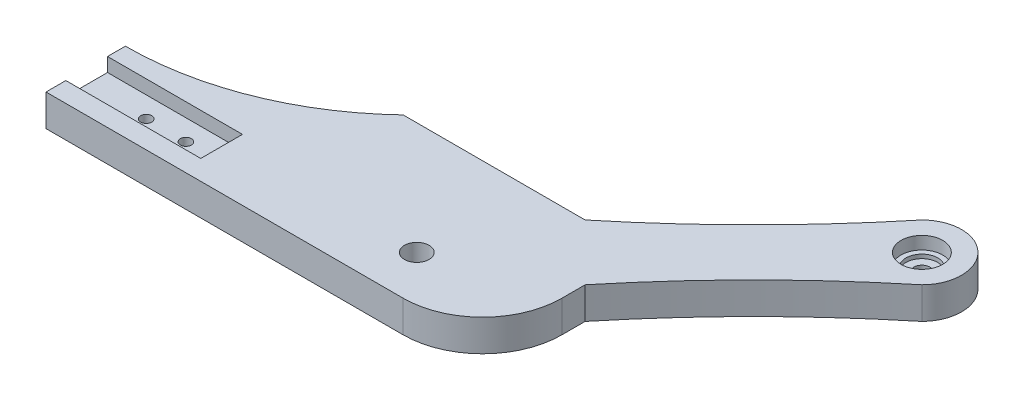
ISO-10303-21;
HEADER;
FILE_DESCRIPTION(('STEP AP214'),'2;1');
FILE_NAME('part.step','',(''),(''),'','','');
FILE_SCHEMA(('AUTOMOTIVE_DESIGN { 1 0 10303 214 1 1 1 1 }'));
ENDSEC;
DATA;
#1=APPLICATION_CONTEXT('core data for automotive mechanical design processes');
#2=APPLICATION_PROTOCOL_DEFINITION('international standard','automotive_design',2000,#1);
#3=PRODUCT_CONTEXT('',#1,'mechanical');
#4=PRODUCT('Part','Part','',(#3));
#5=PRODUCT_RELATED_PRODUCT_CATEGORY('part','',(#4));
#6=PRODUCT_DEFINITION_FORMATION('','',#4);
#7=PRODUCT_DEFINITION_CONTEXT('part definition',#1,'design');
#8=PRODUCT_DEFINITION('design','',#6,#7);
#9=PRODUCT_DEFINITION_SHAPE('','',#8);
#10=(LENGTH_UNIT() NAMED_UNIT(*) SI_UNIT(.MILLI.,.METRE.));
#11=(NAMED_UNIT(*) PLANE_ANGLE_UNIT() SI_UNIT($,.RADIAN.));
#12=(NAMED_UNIT(*) SI_UNIT($,.STERADIAN.) SOLID_ANGLE_UNIT());
#13=UNCERTAINTY_MEASURE_WITH_UNIT(LENGTH_MEASURE(1.E-05),#10,'distance_accuracy_value','');
#14=(GEOMETRIC_REPRESENTATION_CONTEXT(3) GLOBAL_UNCERTAINTY_ASSIGNED_CONTEXT((#13)) GLOBAL_UNIT_ASSIGNED_CONTEXT((#10,
#11,#12)) REPRESENTATION_CONTEXT('',''));
#15=CARTESIAN_POINT('',(0.,0.,0.));
#16=DIRECTION('',(0.,0.,1.));
#17=DIRECTION('',(1.,0.,0.));
#18=AXIS2_PLACEMENT_3D('',#15,#16,#17);
#19=CARTESIAN_POINT('',(26.7157287525382,0.,8.28427124746194));
#20=DIRECTION('',(0.,1.,0.));
#21=DIRECTION('',(0.,0.,1.));
#22=AXIS2_PLACEMENT_3D('',#19,#20,#21);
#23=CYLINDRICAL_SURFACE('',#22,3.09999999999999);
#24=CARTESIAN_POINT('',(26.7157287525382,0.,8.28427124746194));
#25=DIRECTION('',(0.,-1.,0.));
#26=DIRECTION('',(0.,0.,1.));
#27=AXIS2_PLACEMENT_3D('',#24,#25,#26);
#28=CIRCLE('',#27,3.09999999999999);
#29=CARTESIAN_POINT('',(26.7157287525382,0.,11.3842712474619));
#30=VERTEX_POINT('',#29);
#31=EDGE_CURVE('E274',#30,#30,#28,.T.);
#32=ORIENTED_EDGE('',*,*,#31,.T.);
#33=EDGE_LOOP('',(#32));
#34=FACE_BOUND('',#33,.T.);
#35=CARTESIAN_POINT('',(26.7157287525382,8.,8.28427124746194));
#36=DIRECTION('',(0.,1.,0.));
#37=DIRECTION('',(0.,0.,1.));
#38=AXIS2_PLACEMENT_3D('',#35,#36,#37);
#39=CIRCLE('',#38,3.09999999999999);
#40=CARTESIAN_POINT('',(26.7157287525382,8.,11.3842712474619));
#41=VERTEX_POINT('',#40);
#42=EDGE_CURVE('E278',#41,#41,#39,.F.);
#43=ORIENTED_EDGE('',*,*,#42,.F.);
#44=EDGE_LOOP('',(#43));
#45=FACE_BOUND('',#44,.T.);
#46=ADVANCED_FACE('F36',(#34,#45),#23,.F.);
#47=CARTESIAN_POINT('',(90.3553390593273,8.,-55.3553390593275));
#48=DIRECTION('',(0.,1.,0.));
#49=DIRECTION('',(0.,0.,1.));
#50=AXIS2_PLACEMENT_3D('',#47,#48,#49);
#51=PLANE('',#50);
#52=DIRECTION('',(1.,0.,0.));
#53=VECTOR('',#52,1.);
#54=CARTESIAN_POINT('',(-55.,8.,20.));
#55=LINE('',#54,#53);
#56=CARTESIAN_POINT('',(-55.,8.,20.));
#57=VERTEX_POINT('',#56);
#58=CARTESIAN_POINT('',(35.,8.,20.));
#59=VERTEX_POINT('',#58);
#60=EDGE_CURVE('E222',#57,#59,#55,.T.);
#61=ORIENTED_EDGE('',*,*,#60,.T.);
#62=CARTESIAN_POINT('',(35.,8.,0.));
#63=DIRECTION('',(0.,1.,0.));
#64=DIRECTION('',(0.,0.,1.));
#65=AXIS2_PLACEMENT_3D('',#62,#63,#64);
#66=CIRCLE('',#65,20.);
#67=CARTESIAN_POINT('',(55.,8.,0.));
#68=VERTEX_POINT('',#67);
#69=EDGE_CURVE('E11',#59,#68,#66,.T.);
#70=ORIENTED_EDGE('',*,*,#69,.T.);
#71=DIRECTION('',(0.,0.,-1.));
#72=VECTOR('',#71,1.);
#73=CARTESIAN_POINT('',(55.,8.,20.));
#74=LINE('',#73,#72);
#75=CARTESIAN_POINT('',(54.9999999999999,8.,-5.85786437626911));
#76=VERTEX_POINT('',#75);
#77=EDGE_CURVE('E225',#68,#76,#74,.T.);
#78=ORIENTED_EDGE('',*,*,#77,.T.);
#79=CARTESIAN_POINT('',(287.281912627651,8.,183.997641380188));
#80=DIRECTION('',(0.,-1.,0.));
#81=DIRECTION('',(1.,0.,0.));
#82=AXIS2_PLACEMENT_3D('',#79,#80,#81);
#83=CIRCLE('',#82,300.);
#84=CARTESIAN_POINT('',(97.4264068711927,8.,-48.2842712474621));
#85=VERTEX_POINT('',#84);
#86=EDGE_CURVE('E204',#76,#85,#83,.T.);
#87=ORIENTED_EDGE('',*,*,#86,.T.);
#88=CARTESIAN_POINT('',(90.3553390593273,8.,-55.3553390593275));
#89=DIRECTION('',(0.,1.,0.));
#90=DIRECTION('',(0.,0.,1.));
#91=AXIS2_PLACEMENT_3D('',#88,#89,#90);
#92=CIRCLE('',#91,10.);
#93=CARTESIAN_POINT('',(83.2842712474618,8.,-62.4264068711929));
#94=VERTEX_POINT('',#93);
#95=EDGE_CURVE('E228',#85,#94,#92,.T.);
#96=ORIENTED_EDGE('',*,*,#95,.T.);
#97=CARTESIAN_POINT('',(-148.997641380189,8.,-252.28191262765));
#98=DIRECTION('',(0.,1.,0.));
#99=DIRECTION('',(0.,0.,-1.));
#100=AXIS2_PLACEMENT_3D('',#97,#98,#99);
#101=CIRCLE('',#100,300.);
#102=CARTESIAN_POINT('',(40.857864376269,8.,-20.));
#103=VERTEX_POINT('',#102);
#104=EDGE_CURVE('E210',#103,#94,#101,.T.);
#105=ORIENTED_EDGE('',*,*,#104,.F.);
#106=DIRECTION('',(-1.,0.,0.));
#107=VECTOR('',#106,1.);
#108=CARTESIAN_POINT('',(-55.,8.,-20.));
#109=LINE('',#108,#107);
#110=CARTESIAN_POINT('',(-4.99999999999999,8.,-20.));
#111=VERTEX_POINT('',#110);
#112=EDGE_CURVE('E231',#103,#111,#109,.T.);
#113=ORIENTED_EDGE('',*,*,#112,.T.);
#114=CARTESIAN_POINT('',(-55.,8.,-72.5));
#115=DIRECTION('',(0.,1.,0.));
#116=DIRECTION('',(0.,0.,-1.));
#117=AXIS2_PLACEMENT_3D('',#114,#115,#116);
#118=CIRCLE('',#117,72.5);
#119=CARTESIAN_POINT('',(-55.,8.,0.));
#120=VERTEX_POINT('',#119);
#121=EDGE_CURVE('E171',#120,#111,#118,.T.);
#122=ORIENTED_EDGE('',*,*,#121,.F.);
#123=DIRECTION('',(0.,0.,1.));
#124=VECTOR('',#123,1.);
#125=CARTESIAN_POINT('',(-55.,8.,20.));
#126=LINE('',#125,#124);
#127=CARTESIAN_POINT('',(-55.,8.,4.5));
#128=VERTEX_POINT('',#127);
#129=EDGE_CURVE('E219',#120,#128,#126,.T.);
#130=ORIENTED_EDGE('',*,*,#129,.T.);
#131=DIRECTION('',(-1.,0.,0.));
#132=VECTOR('',#131,1.);
#133=CARTESIAN_POINT('',(-55.,8.,4.5));
#134=LINE('',#133,#132);
#135=CARTESIAN_POINT('',(-21.,8.,4.5));
#136=VERTEX_POINT('',#135);
#137=EDGE_CURVE('E154',#136,#128,#134,.T.);
#138=ORIENTED_EDGE('',*,*,#137,.F.);
#139=DIRECTION('',(0.,0.,-1.));
#140=VECTOR('',#139,1.);
#141=CARTESIAN_POINT('',(-21.,8.,15.));
#142=LINE('',#141,#140);
#143=CARTESIAN_POINT('',(-21.,8.,15.));
#144=VERTEX_POINT('',#143);
#145=EDGE_CURVE('E157',#144,#136,#142,.T.);
#146=ORIENTED_EDGE('',*,*,#145,.F.);
#147=DIRECTION('',(1.,0.,0.));
#148=VECTOR('',#147,1.);
#149=CARTESIAN_POINT('',(-55.,8.,15.));
#150=LINE('',#149,#148);
#151=CARTESIAN_POINT('',(-55.,8.,15.));
#152=VERTEX_POINT('',#151);
#153=EDGE_CURVE('E165',#152,#144,#150,.T.);
#154=ORIENTED_EDGE('',*,*,#153,.F.);
#155=EDGE_CURVE('E147',#152,#57,#126,.T.);
#156=ORIENTED_EDGE('',*,*,#155,.T.);
#157=EDGE_LOOP('',(#61,#70,#78,#87,#96,#105,#113,#122,#130,#138,#146,#154,#156));
#158=FACE_BOUND('',#157,.T.);
#159=CARTESIAN_POINT('',(90.3553390593273,8.,-55.3553390593275));
#160=DIRECTION('',(0.,1.,0.));
#161=DIRECTION('',(0.,0.,1.));
#162=AXIS2_PLACEMENT_3D('',#159,#160,#161);
#163=CIRCLE('',#162,5.24999999999999);
#164=CARTESIAN_POINT('',(90.3553390593273,8.,-50.1053390593275));
#165=VERTEX_POINT('',#164);
#166=EDGE_CURVE('E198',#165,#165,#163,.T.);
#167=ORIENTED_EDGE('',*,*,#166,.F.);
#168=EDGE_LOOP('',(#167));
#169=FACE_BOUND('',#168,.T.);
#170=ORIENTED_EDGE('',*,*,#42,.T.);
#171=EDGE_LOOP('',(#170));
#172=FACE_BOUND('',#171,.T.);
#173=ADVANCED_FACE('F282',(#158,#169,#172),#51,.T.);
#174=CARTESIAN_POINT('',(90.3553390593273,0.,-55.3553390593275));
#175=DIRECTION('',(0.,1.,0.));
#176=DIRECTION('',(0.,0.,1.));
#177=AXIS2_PLACEMENT_3D('',#174,#175,#176);
#178=PLANE('',#177);
#179=ORIENTED_EDGE('',*,*,#31,.F.);
#180=EDGE_LOOP('',(#179));
#181=FACE_BOUND('',#180,.T.);
#182=CARTESIAN_POINT('',(-40.,0.,9.75));
#183=DIRECTION('',(0.,1.,0.));
#184=DIRECTION('',(0.,0.,1.));
#185=AXIS2_PLACEMENT_3D('',#182,#183,#184);
#186=CIRCLE('',#185,1.4);
#187=CARTESIAN_POINT('',(-40.,0.,11.15));
#188=VERTEX_POINT('',#187);
#189=EDGE_CURVE('E266',#188,#188,#186,.T.);
#190=ORIENTED_EDGE('',*,*,#189,.T.);
#191=EDGE_LOOP('',(#190));
#192=FACE_BOUND('',#191,.T.);
#193=CARTESIAN_POINT('',(-30.,0.,9.75));
#194=DIRECTION('',(0.,1.,0.));
#195=DIRECTION('',(0.,0.,1.));
#196=AXIS2_PLACEMENT_3D('',#193,#194,#195);
#197=CIRCLE('',#196,1.4);
#198=CARTESIAN_POINT('',(-30.,0.,11.15));
#199=VERTEX_POINT('',#198);
#200=EDGE_CURVE('E160',#199,#199,#197,.T.);
#201=ORIENTED_EDGE('',*,*,#200,.T.);
#202=EDGE_LOOP('',(#201));
#203=FACE_BOUND('',#202,.T.);
#204=CARTESIAN_POINT('',(90.3553390593273,0.,-55.3553390593275));
#205=DIRECTION('',(0.,-1.,0.));
#206=DIRECTION('',(0.,0.,-1.));
#207=AXIS2_PLACEMENT_3D('',#204,#205,#206);
#208=CIRCLE('',#207,4.99999999999999);
#209=CARTESIAN_POINT('',(90.3553390593273,0.,-60.3553390593275));
#210=VERTEX_POINT('',#209);
#211=EDGE_CURVE('E188',#210,#210,#208,.T.);
#212=ORIENTED_EDGE('',*,*,#211,.F.);
#213=EDGE_LOOP('',(#212));
#214=FACE_BOUND('',#213,.T.);
#215=DIRECTION('',(0.,0.,-1.));
#216=VECTOR('',#215,1.);
#217=CARTESIAN_POINT('',(55.,0.,20.));
#218=LINE('',#217,#216);
#219=CARTESIAN_POINT('',(55.,0.,0.));
#220=VERTEX_POINT('',#219);
#221=CARTESIAN_POINT('',(55.,0.,-5.85786437626909));
#222=VERTEX_POINT('',#221);
#223=EDGE_CURVE('E239',#220,#222,#218,.T.);
#224=ORIENTED_EDGE('',*,*,#223,.F.);
#225=CARTESIAN_POINT('',(35.,0.,0.));
#226=DIRECTION('',(0.,1.,0.));
#227=DIRECTION('',(0.,0.,1.));
#228=AXIS2_PLACEMENT_3D('',#225,#226,#227);
#229=CIRCLE('',#228,20.);
#230=CARTESIAN_POINT('',(35.,0.,20.));
#231=VERTEX_POINT('',#230);
#232=EDGE_CURVE('E261',#220,#231,#229,.F.);
#233=ORIENTED_EDGE('',*,*,#232,.T.);
#234=DIRECTION('',(1.,0.,0.));
#235=VECTOR('',#234,1.);
#236=CARTESIAN_POINT('',(-55.,0.,20.));
#237=LINE('',#236,#235);
#238=CARTESIAN_POINT('',(-55.,0.,20.));
#239=VERTEX_POINT('',#238);
#240=EDGE_CURVE('E237',#239,#231,#237,.T.);
#241=ORIENTED_EDGE('',*,*,#240,.F.);
#242=DIRECTION('',(0.,0.,1.));
#243=VECTOR('',#242,1.);
#244=CARTESIAN_POINT('',(-55.,0.,20.));
#245=LINE('',#244,#243);
#246=CARTESIAN_POINT('',(-55.,0.,0.));
#247=VERTEX_POINT('',#246);
#248=EDGE_CURVE('E216',#247,#239,#245,.T.);
#249=ORIENTED_EDGE('',*,*,#248,.F.);
#250=CARTESIAN_POINT('',(-55.,0.,-72.5));
#251=DIRECTION('',(0.,1.,0.));
#252=DIRECTION('',(0.,0.,-1.));
#253=AXIS2_PLACEMENT_3D('',#250,#251,#252);
#254=CIRCLE('',#253,72.5);
#255=CARTESIAN_POINT('',(-4.99999999999999,0.,-20.));
#256=VERTEX_POINT('',#255);
#257=EDGE_CURVE('E175',#247,#256,#254,.T.);
#258=ORIENTED_EDGE('',*,*,#257,.T.);
#259=DIRECTION('',(-1.,0.,0.));
#260=VECTOR('',#259,1.);
#261=CARTESIAN_POINT('',(-55.,0.,-20.));
#262=LINE('',#261,#260);
#263=CARTESIAN_POINT('',(40.857864376269,0.,-20.));
#264=VERTEX_POINT('',#263);
#265=EDGE_CURVE('E245',#264,#256,#262,.T.);
#266=ORIENTED_EDGE('',*,*,#265,.F.);
#267=CARTESIAN_POINT('',(-148.997641380189,0.,-252.28191262765));
#268=DIRECTION('',(0.,1.,0.));
#269=DIRECTION('',(0.,0.,-1.));
#270=AXIS2_PLACEMENT_3D('',#267,#268,#269);
#271=CIRCLE('',#270,300.);
#272=CARTESIAN_POINT('',(83.2842712474618,0.,-62.4264068711929));
#273=VERTEX_POINT('',#272);
#274=EDGE_CURVE('E213',#264,#273,#271,.T.);
#275=ORIENTED_EDGE('',*,*,#274,.T.);
#276=CARTESIAN_POINT('',(90.3553390593273,0.,-55.3553390593275));
#277=DIRECTION('',(0.,1.,0.));
#278=DIRECTION('',(0.,0.,1.));
#279=AXIS2_PLACEMENT_3D('',#276,#277,#278);
#280=CIRCLE('',#279,10.);
#281=CARTESIAN_POINT('',(97.4264068711927,0.,-48.2842712474621));
#282=VERTEX_POINT('',#281);
#283=EDGE_CURVE('E242',#282,#273,#280,.T.);
#284=ORIENTED_EDGE('',*,*,#283,.F.);
#285=CARTESIAN_POINT('',(287.281912627651,0.,183.997641380188));
#286=DIRECTION('',(0.,-1.,0.));
#287=DIRECTION('',(1.,0.,0.));
#288=AXIS2_PLACEMENT_3D('',#285,#286,#287);
#289=CIRCLE('',#288,300.);
#290=EDGE_CURVE('E207',#222,#282,#289,.T.);
#291=ORIENTED_EDGE('',*,*,#290,.F.);
#292=EDGE_LOOP('',(#224,#233,#241,#249,#258,#266,#275,#284,#291));
#293=FACE_BOUND('',#292,.T.);
#294=ADVANCED_FACE('F290',(#181,#192,#203,#214,#293),#178,.F.);
#295=CARTESIAN_POINT('',(-55.,8.,20.));
#296=DIRECTION('',(1.,0.,0.));
#297=DIRECTION('',(0.,0.,-1.));
#298=AXIS2_PLACEMENT_3D('',#295,#296,#297);
#299=PLANE('',#298);
#300=DIRECTION('',(0.,0.,1.));
#301=VECTOR('',#300,1.);
#302=CARTESIAN_POINT('',(-55.,4.5,15.));
#303=LINE('',#302,#301);
#304=CARTESIAN_POINT('',(-55.,4.5,4.5));
#305=VERTEX_POINT('',#304);
#306=CARTESIAN_POINT('',(-55.,4.5,15.));
#307=VERTEX_POINT('',#306);
#308=EDGE_CURVE('E141',#305,#307,#303,.T.);
#309=ORIENTED_EDGE('',*,*,#308,.F.);
#310=DIRECTION('',(0.,1.,0.));
#311=VECTOR('',#310,1.);
#312=CARTESIAN_POINT('',(-55.,4.5,4.5));
#313=LINE('',#312,#311);
#314=EDGE_CURVE('E169',#305,#128,#313,.T.);
#315=ORIENTED_EDGE('',*,*,#314,.T.);
#316=ORIENTED_EDGE('',*,*,#129,.F.);
#317=DIRECTION('',(0.,1.,0.));
#318=VECTOR('',#317,1.);
#319=CARTESIAN_POINT('',(-55.,0.,0.));
#320=LINE('',#319,#318);
#321=EDGE_CURVE('E181',#247,#120,#320,.T.);
#322=ORIENTED_EDGE('',*,*,#321,.F.);
#323=ORIENTED_EDGE('',*,*,#248,.T.);
#324=DIRECTION('',(0.,-1.,0.));
#325=VECTOR('',#324,1.);
#326=CARTESIAN_POINT('',(-55.,8.,20.));
#327=LINE('',#326,#325);
#328=EDGE_CURVE('E255',#57,#239,#327,.T.);
#329=ORIENTED_EDGE('',*,*,#328,.F.);
#330=ORIENTED_EDGE('',*,*,#155,.F.);
#331=DIRECTION('',(0.,1.,0.));
#332=VECTOR('',#331,1.);
#333=CARTESIAN_POINT('',(-55.,4.5,15.));
#334=LINE('',#333,#332);
#335=EDGE_CURVE('E134',#307,#152,#334,.T.);
#336=ORIENTED_EDGE('',*,*,#335,.F.);
#337=EDGE_LOOP('',(#309,#315,#316,#322,#323,#329,#330,#336));
#338=FACE_BOUND('',#337,.T.);
#339=ADVANCED_FACE('F145',(#338),#299,.F.);
#340=CARTESIAN_POINT('',(-55.,8.,20.));
#341=DIRECTION('',(0.,0.,-1.));
#342=DIRECTION('',(-1.,0.,0.));
#343=AXIS2_PLACEMENT_3D('',#340,#341,#342);
#344=PLANE('',#343);
#345=ORIENTED_EDGE('',*,*,#240,.T.);
#346=DIRECTION('',(0.,-1.,0.));
#347=VECTOR('',#346,1.);
#348=CARTESIAN_POINT('',(35.,8.,20.));
#349=LINE('',#348,#347);
#350=EDGE_CURVE('E45',#231,#59,#349,.F.);
#351=ORIENTED_EDGE('',*,*,#350,.T.);
#352=ORIENTED_EDGE('',*,*,#60,.F.);
#353=ORIENTED_EDGE('',*,*,#328,.T.);
#354=EDGE_LOOP('',(#345,#351,#352,#353));
#355=FACE_BOUND('',#354,.T.);
#356=ADVANCED_FACE('F369',(#355),#344,.F.);
#357=CARTESIAN_POINT('',(55.,8.,20.));
#358=DIRECTION('',(-1.,0.,0.));
#359=DIRECTION('',(0.,0.,1.));
#360=AXIS2_PLACEMENT_3D('',#357,#358,#359);
#361=PLANE('',#360);
#362=ORIENTED_EDGE('',*,*,#77,.F.);
#363=DIRECTION('',(0.,-1.,0.));
#364=VECTOR('',#363,1.);
#365=CARTESIAN_POINT('',(55.,8.,0.));
#366=LINE('',#365,#364);
#367=EDGE_CURVE('E257',#68,#220,#366,.T.);
#368=ORIENTED_EDGE('',*,*,#367,.T.);
#369=ORIENTED_EDGE('',*,*,#223,.T.);
#370=DIRECTION('',(0.,-1.,0.));
#371=VECTOR('',#370,1.);
#372=CARTESIAN_POINT('',(55.,8.,-5.85786437626909));
#373=LINE('',#372,#371);
#374=EDGE_CURVE('E253',#76,#222,#373,.T.);
#375=ORIENTED_EDGE('',*,*,#374,.F.);
#376=EDGE_LOOP('',(#362,#368,#369,#375));
#377=FACE_BOUND('',#376,.T.);
#378=ADVANCED_FACE('F365',(#377),#361,.F.);
#379=CARTESIAN_POINT('',(90.3553390593273,8.,-55.3553390593275));
#380=DIRECTION('',(0.,-1.,0.));
#381=DIRECTION('',(0.,0.,-1.));
#382=AXIS2_PLACEMENT_3D('',#379,#380,#381);
#383=CYLINDRICAL_SURFACE('',#382,10.);
#384=ORIENTED_EDGE('',*,*,#283,.T.);
#385=DIRECTION('',(0.,-1.,0.));
#386=VECTOR('',#385,1.);
#387=CARTESIAN_POINT('',(83.2842712474618,8.,-62.4264068711929));
#388=LINE('',#387,#386);
#389=EDGE_CURVE('E249',#94,#273,#388,.T.);
#390=ORIENTED_EDGE('',*,*,#389,.F.);
#391=ORIENTED_EDGE('',*,*,#95,.F.);
#392=DIRECTION('',(0.,-1.,0.));
#393=VECTOR('',#392,1.);
#394=CARTESIAN_POINT('',(97.4264068711928,8.,-48.284271247462));
#395=LINE('',#394,#393);
#396=EDGE_CURVE('E251',#85,#282,#395,.T.);
#397=ORIENTED_EDGE('',*,*,#396,.T.);
#398=EDGE_LOOP('',(#384,#390,#391,#397));
#399=FACE_BOUND('',#398,.T.);
#400=ADVANCED_FACE('F361',(#399),#383,.T.);
#401=CARTESIAN_POINT('',(-55.,8.,-20.));
#402=DIRECTION('',(0.,0.,1.));
#403=DIRECTION('',(1.,0.,0.));
#404=AXIS2_PLACEMENT_3D('',#401,#402,#403);
#405=PLANE('',#404);
#406=ORIENTED_EDGE('',*,*,#265,.T.);
#407=DIRECTION('',(0.,1.,0.));
#408=VECTOR('',#407,1.);
#409=CARTESIAN_POINT('',(-4.99999999999999,0.,-20.));
#410=LINE('',#409,#408);
#411=EDGE_CURVE('E178',#256,#111,#410,.T.);
#412=ORIENTED_EDGE('',*,*,#411,.T.);
#413=ORIENTED_EDGE('',*,*,#112,.F.);
#414=DIRECTION('',(0.,-1.,0.));
#415=VECTOR('',#414,1.);
#416=CARTESIAN_POINT('',(40.857864376269,8.,-20.));
#417=LINE('',#416,#415);
#418=EDGE_CURVE('E234',#103,#264,#417,.T.);
#419=ORIENTED_EDGE('',*,*,#418,.T.);
#420=EDGE_LOOP('',(#406,#412,#413,#419));
#421=FACE_BOUND('',#420,.T.);
#422=ADVANCED_FACE('F353',(#421),#405,.F.);
#423=CARTESIAN_POINT('',(-148.997641380189,0.,-252.28191262765));
#424=DIRECTION('',(0.,1.,0.));
#425=DIRECTION('',(0.,0.,1.));
#426=AXIS2_PLACEMENT_3D('',#423,#424,#425);
#427=CYLINDRICAL_SURFACE('',#426,300.);
#428=ORIENTED_EDGE('',*,*,#104,.T.);
#429=ORIENTED_EDGE('',*,*,#389,.T.);
#430=ORIENTED_EDGE('',*,*,#274,.F.);
#431=ORIENTED_EDGE('',*,*,#418,.F.);
#432=EDGE_LOOP('',(#428,#429,#430,#431));
#433=FACE_BOUND('',#432,.T.);
#434=ADVANCED_FACE('F350',(#433),#427,.F.);
#435=CARTESIAN_POINT('',(287.281912627651,0.,183.997641380188));
#436=DIRECTION('',(0.,1.,0.));
#437=DIRECTION('',(0.,0.,1.));
#438=AXIS2_PLACEMENT_3D('',#435,#436,#437);
#439=CYLINDRICAL_SURFACE('',#438,300.);
#440=ORIENTED_EDGE('',*,*,#86,.F.);
#441=ORIENTED_EDGE('',*,*,#374,.T.);
#442=ORIENTED_EDGE('',*,*,#290,.T.);
#443=ORIENTED_EDGE('',*,*,#396,.F.);
#444=EDGE_LOOP('',(#440,#441,#442,#443));
#445=FACE_BOUND('',#444,.T.);
#446=ADVANCED_FACE('F343',(#445),#439,.F.);
#447=CARTESIAN_POINT('',(90.3553390593273,4.8,-55.3553390593275));
#448=DIRECTION('',(0.,1.,0.));
#449=DIRECTION('',(0.,0.,1.));
#450=AXIS2_PLACEMENT_3D('',#447,#448,#449);
#451=PLANE('',#450);
#452=CARTESIAN_POINT('',(90.3553390593273,4.8,-55.3553390593275));
#453=DIRECTION('',(0.,1.,0.));
#454=DIRECTION('',(0.,0.,1.));
#455=AXIS2_PLACEMENT_3D('',#452,#453,#454);
#456=CIRCLE('',#455,4.00000000000001);
#457=CARTESIAN_POINT('',(90.3553390593273,4.8,-51.3553390593275));
#458=VERTEX_POINT('',#457);
#459=EDGE_CURVE('E192',#458,#458,#456,.T.);
#460=ORIENTED_EDGE('',*,*,#459,.F.);
#461=EDGE_LOOP('',(#460));
#462=FACE_BOUND('',#461,.T.);
#463=CARTESIAN_POINT('',(90.3553390593273,4.8,-55.3553390593275));
#464=DIRECTION('',(0.,1.,0.));
#465=DIRECTION('',(0.,0.,1.));
#466=AXIS2_PLACEMENT_3D('',#463,#464,#465);
#467=CIRCLE('',#466,5.24999999999999);
#468=CARTESIAN_POINT('',(90.3553390593273,4.8,-50.1053390593275));
#469=VERTEX_POINT('',#468);
#470=EDGE_CURVE('E201',#469,#469,#467,.T.);
#471=ORIENTED_EDGE('',*,*,#470,.T.);
#472=EDGE_LOOP('',(#471));
#473=FACE_BOUND('',#472,.T.);
#474=ADVANCED_FACE('F340',(#462,#473),#451,.T.);
#475=CARTESIAN_POINT('',(90.3553390593273,4.8,-55.3553390593275));
#476=DIRECTION('',(0.,1.,0.));
#477=DIRECTION('',(0.,0.,1.));
#478=AXIS2_PLACEMENT_3D('',#475,#476,#477);
#479=CYLINDRICAL_SURFACE('',#478,5.24999999999999);
#480=ORIENTED_EDGE('',*,*,#470,.F.);
#481=EDGE_LOOP('',(#480));
#482=FACE_BOUND('',#481,.T.);
#483=ORIENTED_EDGE('',*,*,#166,.T.);
#484=EDGE_LOOP('',(#483));
#485=FACE_BOUND('',#484,.T.);
#486=ADVANCED_FACE('F335',(#482,#485),#479,.F.);
#487=CARTESIAN_POINT('',(90.3553390593273,3.8,-55.3553390593275));
#488=DIRECTION('',(0.,1.,0.));
#489=DIRECTION('',(0.,0.,1.));
#490=AXIS2_PLACEMENT_3D('',#487,#488,#489);
#491=PLANE('',#490);
#492=CARTESIAN_POINT('',(90.3553390593273,3.8,-55.3553390593275));
#493=DIRECTION('',(0.,1.,0.));
#494=DIRECTION('',(0.,0.,1.));
#495=AXIS2_PLACEMENT_3D('',#492,#493,#494);
#496=CIRCLE('',#495,2.);
#497=CARTESIAN_POINT('',(90.3553390593273,3.8,-53.3553390593275));
#498=VERTEX_POINT('',#497);
#499=EDGE_CURVE('E185',#498,#498,#496,.T.);
#500=ORIENTED_EDGE('',*,*,#499,.F.);
#501=EDGE_LOOP('',(#500));
#502=FACE_BOUND('',#501,.T.);
#503=CARTESIAN_POINT('',(90.3553390593273,3.8,-55.3553390593275));
#504=DIRECTION('',(0.,1.,0.));
#505=DIRECTION('',(0.,0.,1.));
#506=AXIS2_PLACEMENT_3D('',#503,#504,#505);
#507=CIRCLE('',#506,4.00000000000001);
#508=CARTESIAN_POINT('',(90.3553390593273,3.8,-51.3553390593275));
#509=VERTEX_POINT('',#508);
#510=EDGE_CURVE('E195',#509,#509,#507,.T.);
#511=ORIENTED_EDGE('',*,*,#510,.T.);
#512=EDGE_LOOP('',(#511));
#513=FACE_BOUND('',#512,.T.);
#514=ADVANCED_FACE('F332',(#502,#513),#491,.T.);
#515=CARTESIAN_POINT('',(90.3553390593273,3.8,-55.3553390593275));
#516=DIRECTION('',(0.,1.,0.));
#517=DIRECTION('',(0.,0.,1.));
#518=AXIS2_PLACEMENT_3D('',#515,#516,#517);
#519=CYLINDRICAL_SURFACE('',#518,4.00000000000001);
#520=ORIENTED_EDGE('',*,*,#510,.F.);
#521=EDGE_LOOP('',(#520));
#522=FACE_BOUND('',#521,.T.);
#523=ORIENTED_EDGE('',*,*,#459,.T.);
#524=EDGE_LOOP('',(#523));
#525=FACE_BOUND('',#524,.T.);
#526=ADVANCED_FACE('F327',(#522,#525),#519,.F.);
#527=CARTESIAN_POINT('',(90.3553390593273,2.,-55.3553390593275));
#528=DIRECTION('',(0.,-1.,0.));
#529=DIRECTION('',(0.,0.,-1.));
#530=AXIS2_PLACEMENT_3D('',#527,#528,#529);
#531=PLANE('',#530);
#532=CARTESIAN_POINT('',(90.3553390593273,2.,-55.3553390593275));
#533=DIRECTION('',(0.,-1.,0.));
#534=DIRECTION('',(0.,0.,-1.));
#535=AXIS2_PLACEMENT_3D('',#532,#533,#534);
#536=CIRCLE('',#535,2.);
#537=CARTESIAN_POINT('',(90.3553390593273,2.,-57.3553390593275));
#538=VERTEX_POINT('',#537);
#539=EDGE_CURVE('E183',#538,#538,#536,.T.);
#540=ORIENTED_EDGE('',*,*,#539,.F.);
#541=EDGE_LOOP('',(#540));
#542=FACE_BOUND('',#541,.T.);
#543=CARTESIAN_POINT('',(90.3553390593273,2.,-55.3553390593275));
#544=DIRECTION('',(0.,-1.,0.));
#545=DIRECTION('',(0.,0.,-1.));
#546=AXIS2_PLACEMENT_3D('',#543,#544,#545);
#547=CIRCLE('',#546,4.99999999999999);
#548=CARTESIAN_POINT('',(90.3553390593273,2.,-60.3553390593275));
#549=VERTEX_POINT('',#548);
#550=EDGE_CURVE('E189',#549,#549,#547,.T.);
#551=ORIENTED_EDGE('',*,*,#550,.T.);
#552=EDGE_LOOP('',(#551));
#553=FACE_BOUND('',#552,.T.);
#554=ADVANCED_FACE('F324',(#542,#553),#531,.T.);
#555=CARTESIAN_POINT('',(90.3553390593273,2.,-55.3553390593275));
#556=DIRECTION('',(0.,-1.,0.));
#557=DIRECTION('',(0.,0.,-1.));
#558=AXIS2_PLACEMENT_3D('',#555,#556,#557);
#559=CYLINDRICAL_SURFACE('',#558,4.99999999999999);
#560=ORIENTED_EDGE('',*,*,#550,.F.);
#561=EDGE_LOOP('',(#560));
#562=FACE_BOUND('',#561,.T.);
#563=ORIENTED_EDGE('',*,*,#211,.T.);
#564=EDGE_LOOP('',(#563));
#565=FACE_BOUND('',#564,.T.);
#566=ADVANCED_FACE('F322',(#562,#565),#559,.F.);
#567=CARTESIAN_POINT('',(90.3553390593273,0.,-55.3553390593275));
#568=DIRECTION('',(0.,1.,0.));
#569=DIRECTION('',(0.,0.,1.));
#570=AXIS2_PLACEMENT_3D('',#567,#568,#569);
#571=CYLINDRICAL_SURFACE('',#570,2.);
#572=ORIENTED_EDGE('',*,*,#499,.T.);
#573=EDGE_LOOP('',(#572));
#574=FACE_BOUND('',#573,.T.);
#575=ORIENTED_EDGE('',*,*,#539,.T.);
#576=EDGE_LOOP('',(#575));
#577=FACE_BOUND('',#576,.T.);
#578=ADVANCED_FACE('F318',(#574,#577),#571,.F.);
#579=CARTESIAN_POINT('',(-55.,0.,-72.5));
#580=DIRECTION('',(0.,1.,0.));
#581=DIRECTION('',(0.,0.,1.));
#582=AXIS2_PLACEMENT_3D('',#579,#580,#581);
#583=CYLINDRICAL_SURFACE('',#582,72.5);
#584=ORIENTED_EDGE('',*,*,#121,.T.);
#585=ORIENTED_EDGE('',*,*,#411,.F.);
#586=ORIENTED_EDGE('',*,*,#257,.F.);
#587=ORIENTED_EDGE('',*,*,#321,.T.);
#588=EDGE_LOOP('',(#584,#585,#586,#587));
#589=FACE_BOUND('',#588,.T.);
#590=ADVANCED_FACE('F309',(#589),#583,.F.);
#591=CARTESIAN_POINT('',(-55.,4.5,4.5));
#592=DIRECTION('',(0.,0.,-1.));
#593=DIRECTION('',(-1.,0.,0.));
#594=AXIS2_PLACEMENT_3D('',#591,#592,#593);
#595=PLANE('',#594);
#596=ORIENTED_EDGE('',*,*,#137,.T.);
#597=ORIENTED_EDGE('',*,*,#314,.F.);
#598=DIRECTION('',(-1.,0.,0.));
#599=VECTOR('',#598,1.);
#600=CARTESIAN_POINT('',(-55.,4.5,4.5));
#601=LINE('',#600,#599);
#602=CARTESIAN_POINT('',(-21.,4.5,4.5));
#603=VERTEX_POINT('',#602);
#604=EDGE_CURVE('E149',#603,#305,#601,.T.);
#605=ORIENTED_EDGE('',*,*,#604,.F.);
#606=DIRECTION('',(0.,1.,0.));
#607=VECTOR('',#606,1.);
#608=CARTESIAN_POINT('',(-21.,4.5,4.5));
#609=LINE('',#608,#607);
#610=EDGE_CURVE('E172',#603,#136,#609,.T.);
#611=ORIENTED_EDGE('',*,*,#610,.T.);
#612=EDGE_LOOP('',(#596,#597,#605,#611));
#613=FACE_BOUND('',#612,.T.);
#614=ADVANCED_FACE('F305',(#613),#595,.F.);
#615=CARTESIAN_POINT('',(-21.,4.5,15.));
#616=DIRECTION('',(1.,0.,0.));
#617=DIRECTION('',(0.,0.,-1.));
#618=AXIS2_PLACEMENT_3D('',#615,#616,#617);
#619=PLANE('',#618);
#620=ORIENTED_EDGE('',*,*,#145,.T.);
#621=ORIENTED_EDGE('',*,*,#610,.F.);
#622=DIRECTION('',(0.,0.,-1.));
#623=VECTOR('',#622,1.);
#624=CARTESIAN_POINT('',(-21.,4.5,15.));
#625=LINE('',#624,#623);
#626=CARTESIAN_POINT('',(-21.,4.5,15.));
#627=VERTEX_POINT('',#626);
#628=EDGE_CURVE('E140',#627,#603,#625,.T.);
#629=ORIENTED_EDGE('',*,*,#628,.F.);
#630=DIRECTION('',(0.,1.,0.));
#631=VECTOR('',#630,1.);
#632=CARTESIAN_POINT('',(-21.,4.5,15.));
#633=LINE('',#632,#631);
#634=EDGE_CURVE('E136',#627,#144,#633,.T.);
#635=ORIENTED_EDGE('',*,*,#634,.T.);
#636=EDGE_LOOP('',(#620,#621,#629,#635));
#637=FACE_BOUND('',#636,.T.);
#638=ADVANCED_FACE('F308',(#637),#619,.F.);
#639=CARTESIAN_POINT('',(-55.,4.5,15.));
#640=DIRECTION('',(0.,0.,1.));
#641=DIRECTION('',(1.,0.,0.));
#642=AXIS2_PLACEMENT_3D('',#639,#640,#641);
#643=PLANE('',#642);
#644=ORIENTED_EDGE('',*,*,#153,.T.);
#645=ORIENTED_EDGE('',*,*,#634,.F.);
#646=DIRECTION('',(1.,0.,0.));
#647=VECTOR('',#646,1.);
#648=CARTESIAN_POINT('',(-55.,4.5,15.));
#649=LINE('',#648,#647);
#650=EDGE_CURVE('E130',#307,#627,#649,.T.);
#651=ORIENTED_EDGE('',*,*,#650,.F.);
#652=ORIENTED_EDGE('',*,*,#335,.T.);
#653=EDGE_LOOP('',(#644,#645,#651,#652));
#654=FACE_BOUND('',#653,.T.);
#655=ADVANCED_FACE('F133',(#654),#643,.F.);
#656=CARTESIAN_POINT('',(0.,4.5,0.));
#657=DIRECTION('',(0.,-1.,0.));
#658=DIRECTION('',(0.,0.,-1.));
#659=AXIS2_PLACEMENT_3D('',#656,#657,#658);
#660=PLANE('',#659);
#661=CARTESIAN_POINT('',(-40.,4.5,9.75));
#662=DIRECTION('',(0.,-1.,0.));
#663=DIRECTION('',(0.,0.,-1.));
#664=AXIS2_PLACEMENT_3D('',#661,#662,#663);
#665=CIRCLE('',#664,1.4);
#666=CARTESIAN_POINT('',(-40.,4.5,8.35000000000001));
#667=VERTEX_POINT('',#666);
#668=EDGE_CURVE('E40',#667,#667,#665,.T.);
#669=ORIENTED_EDGE('',*,*,#668,.T.);
#670=EDGE_LOOP('',(#669));
#671=FACE_BOUND('',#670,.T.);
#672=CARTESIAN_POINT('',(-30.,4.5,9.75));
#673=DIRECTION('',(0.,-1.,0.));
#674=DIRECTION('',(0.,0.,-1.));
#675=AXIS2_PLACEMENT_3D('',#672,#673,#674);
#676=CIRCLE('',#675,1.4);
#677=CARTESIAN_POINT('',(-30.,4.5,8.35));
#678=VERTEX_POINT('',#677);
#679=EDGE_CURVE('E264',#678,#678,#676,.T.);
#680=ORIENTED_EDGE('',*,*,#679,.T.);
#681=EDGE_LOOP('',(#680));
#682=FACE_BOUND('',#681,.T.);
#683=ORIENTED_EDGE('',*,*,#308,.T.);
#684=ORIENTED_EDGE('',*,*,#650,.T.);
#685=ORIENTED_EDGE('',*,*,#628,.T.);
#686=ORIENTED_EDGE('',*,*,#604,.T.);
#687=EDGE_LOOP('',(#683,#684,#685,#686));
#688=FACE_BOUND('',#687,.T.);
#689=ADVANCED_FACE('F151',(#671,#682,#688),#660,.F.);
#690=CARTESIAN_POINT('',(35.,8.,0.));
#691=DIRECTION('',(0.,-1.,0.));
#692=DIRECTION('',(0.,0.,-1.));
#693=AXIS2_PLACEMENT_3D('',#690,#691,#692);
#694=CYLINDRICAL_SURFACE('',#693,20.);
#695=ORIENTED_EDGE('',*,*,#69,.F.);
#696=ORIENTED_EDGE('',*,*,#350,.F.);
#697=ORIENTED_EDGE('',*,*,#232,.F.);
#698=ORIENTED_EDGE('',*,*,#367,.F.);
#699=EDGE_LOOP('',(#695,#696,#697,#698));
#700=FACE_BOUND('',#699,.T.);
#701=ADVANCED_FACE('F38',(#700),#694,.T.);
#702=CARTESIAN_POINT('',(-30.,0.,9.75));
#703=DIRECTION('',(0.,1.,0.));
#704=DIRECTION('',(0.,0.,1.));
#705=AXIS2_PLACEMENT_3D('',#702,#703,#704);
#706=CYLINDRICAL_SURFACE('',#705,1.4);
#707=ORIENTED_EDGE('',*,*,#200,.F.);
#708=EDGE_LOOP('',(#707));
#709=FACE_BOUND('',#708,.T.);
#710=ORIENTED_EDGE('',*,*,#679,.F.);
#711=EDGE_LOOP('',(#710));
#712=FACE_BOUND('',#711,.T.);
#713=ADVANCED_FACE('F297',(#709,#712),#706,.F.);
#714=CARTESIAN_POINT('',(-40.,0.,9.75));
#715=DIRECTION('',(0.,1.,0.));
#716=DIRECTION('',(0.,0.,1.));
#717=AXIS2_PLACEMENT_3D('',#714,#715,#716);
#718=CYLINDRICAL_SURFACE('',#717,1.4);
#719=ORIENTED_EDGE('',*,*,#189,.F.);
#720=EDGE_LOOP('',(#719));
#721=FACE_BOUND('',#720,.T.);
#722=ORIENTED_EDGE('',*,*,#668,.F.);
#723=EDGE_LOOP('',(#722));
#724=FACE_BOUND('',#723,.T.);
#725=ADVANCED_FACE('F294',(#721,#724),#718,.F.);
#726=CLOSED_SHELL('',(#46,#173,#294,#339,#356,#378,#400,#422,#434,#446,#474,#486,#514,#526,#554,
#566,#578,#590,#614,#638,#655,#689,#701,#713,#725));
#727=MANIFOLD_SOLID_BREP('B2',#726);
#728=ADVANCED_BREP_SHAPE_REPRESENTATION('',(#18,#727),#14);
#729=SHAPE_DEFINITION_REPRESENTATION(#9,#728);
ENDSEC;
END-ISO-10303-21;
